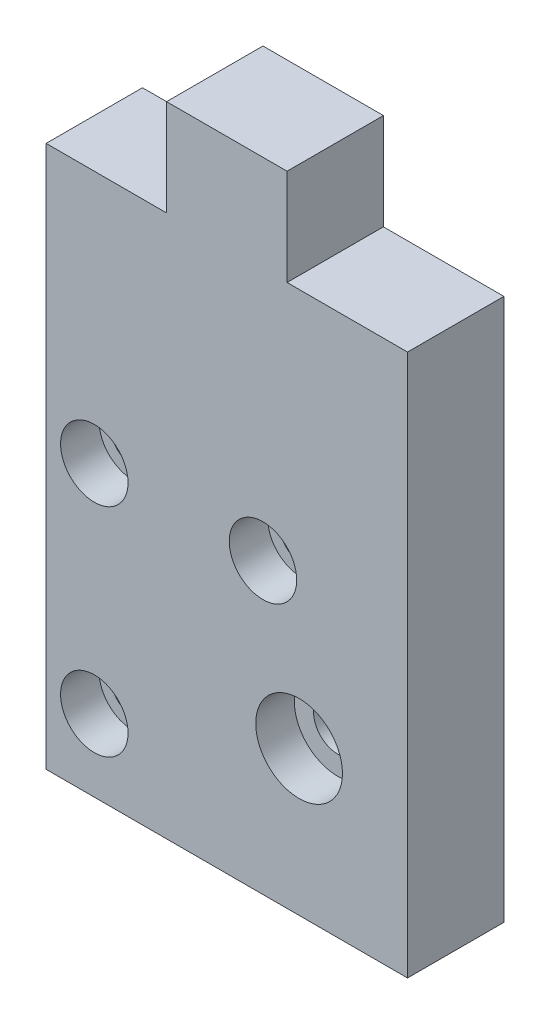
ISO-10303-21;
HEADER;
FILE_DESCRIPTION(('STEP AP214'),'2;1');
FILE_NAME('part.step','',(''),(''),'','','');
FILE_SCHEMA(('AUTOMOTIVE_DESIGN { 1 0 10303 214 1 1 1 1 }'));
ENDSEC;
DATA;
#1=APPLICATION_CONTEXT('core data for automotive mechanical design processes');
#2=APPLICATION_PROTOCOL_DEFINITION('international standard','automotive_design',2000,#1);
#3=PRODUCT_CONTEXT('',#1,'mechanical');
#4=PRODUCT('Part','Part','',(#3));
#5=PRODUCT_RELATED_PRODUCT_CATEGORY('part','',(#4));
#6=PRODUCT_DEFINITION_FORMATION('','',#4);
#7=PRODUCT_DEFINITION_CONTEXT('part definition',#1,'design');
#8=PRODUCT_DEFINITION('design','',#6,#7);
#9=PRODUCT_DEFINITION_SHAPE('','',#8);
#10=(LENGTH_UNIT() NAMED_UNIT(*) SI_UNIT(.MILLI.,.METRE.));
#11=(NAMED_UNIT(*) PLANE_ANGLE_UNIT() SI_UNIT($,.RADIAN.));
#12=(NAMED_UNIT(*) SI_UNIT($,.STERADIAN.) SOLID_ANGLE_UNIT());
#13=UNCERTAINTY_MEASURE_WITH_UNIT(LENGTH_MEASURE(1.E-05),#10,'distance_accuracy_value','');
#14=(GEOMETRIC_REPRESENTATION_CONTEXT(3) GLOBAL_UNCERTAINTY_ASSIGNED_CONTEXT((#13)) GLOBAL_UNIT_ASSIGNED_CONTEXT((#10,
#11,#12)) REPRESENTATION_CONTEXT('',''));
#15=CARTESIAN_POINT('',(0.,0.,0.));
#16=DIRECTION('',(0.,0.,1.));
#17=DIRECTION('',(1.,0.,0.));
#18=AXIS2_PLACEMENT_3D('',#15,#16,#17);
#19=CARTESIAN_POINT('',(5.08,7.62,10.16));
#20=DIRECTION('',(0.,0.,-1.));
#21=DIRECTION('',(-1.,0.,0.));
#22=AXIS2_PLACEMENT_3D('',#19,#20,#21);
#23=CYLINDRICAL_SURFACE('',#22,2.286);
#24=CARTESIAN_POINT('',(5.08,7.62,0.));
#25=DIRECTION('',(0.,0.,1.));
#26=DIRECTION('',(1.,0.,0.));
#27=AXIS2_PLACEMENT_3D('',#24,#25,#26);
#28=CIRCLE('',#27,2.286);
#29=CARTESIAN_POINT('',(7.366,7.62,0.));
#30=VERTEX_POINT('',#29);
#31=EDGE_CURVE('E136',#30,#30,#28,.T.);
#32=ORIENTED_EDGE('',*,*,#31,.F.);
#33=EDGE_LOOP('',(#32));
#34=FACE_BOUND('',#33,.T.);
#35=CARTESIAN_POINT('',(5.08,7.62,6.096));
#36=DIRECTION('',(0.,0.,1.));
#37=DIRECTION('',(1.,0.,0.));
#38=AXIS2_PLACEMENT_3D('',#35,#36,#37);
#39=CIRCLE('',#38,2.286);
#40=CARTESIAN_POINT('',(7.366,7.62,6.096));
#41=VERTEX_POINT('',#40);
#42=EDGE_CURVE('E37',#41,#41,#39,.T.);
#43=ORIENTED_EDGE('',*,*,#42,.T.);
#44=EDGE_LOOP('',(#43));
#45=FACE_BOUND('',#44,.T.);
#46=ADVANCED_FACE('F33',(#34,#45),#23,.F.);
#47=CARTESIAN_POINT('',(5.08,30.48,10.16));
#48=DIRECTION('',(0.,0.,-1.));
#49=DIRECTION('',(-1.,0.,0.));
#50=AXIS2_PLACEMENT_3D('',#47,#48,#49);
#51=CYLINDRICAL_SURFACE('',#50,2.286);
#52=CARTESIAN_POINT('',(5.08,30.48,0.));
#53=DIRECTION('',(0.,0.,1.));
#54=DIRECTION('',(1.,0.,0.));
#55=AXIS2_PLACEMENT_3D('',#52,#53,#54);
#56=CIRCLE('',#55,2.286);
#57=CARTESIAN_POINT('',(7.366,30.48,0.));
#58=VERTEX_POINT('',#57);
#59=EDGE_CURVE('E179',#58,#58,#56,.T.);
#60=ORIENTED_EDGE('',*,*,#59,.F.);
#61=EDGE_LOOP('',(#60));
#62=FACE_BOUND('',#61,.T.);
#63=CARTESIAN_POINT('',(5.08,30.48,6.096));
#64=DIRECTION('',(0.,0.,1.));
#65=DIRECTION('',(1.,0.,0.));
#66=AXIS2_PLACEMENT_3D('',#63,#64,#65);
#67=CIRCLE('',#66,2.286);
#68=CARTESIAN_POINT('',(7.366,30.48,6.096));
#69=VERTEX_POINT('',#68);
#70=EDGE_CURVE('E165',#69,#69,#67,.T.);
#71=ORIENTED_EDGE('',*,*,#70,.T.);
#72=EDGE_LOOP('',(#71));
#73=FACE_BOUND('',#72,.T.);
#74=ADVANCED_FACE('F226',(#62,#73),#51,.F.);
#75=CARTESIAN_POINT('',(26.67,15.24,10.16));
#76=DIRECTION('',(0.,0.,-1.));
#77=DIRECTION('',(-1.,0.,0.));
#78=AXIS2_PLACEMENT_3D('',#75,#76,#77);
#79=CYLINDRICAL_SURFACE('',#78,2.54);
#80=CARTESIAN_POINT('',(26.67,15.24,0.));
#81=DIRECTION('',(0.,0.,1.));
#82=DIRECTION('',(1.,0.,0.));
#83=AXIS2_PLACEMENT_3D('',#80,#81,#82);
#84=CIRCLE('',#83,2.54);
#85=CARTESIAN_POINT('',(29.21,15.24,0.));
#86=VERTEX_POINT('',#85);
#87=EDGE_CURVE('E174',#86,#86,#84,.T.);
#88=ORIENTED_EDGE('',*,*,#87,.F.);
#89=EDGE_LOOP('',(#88));
#90=FACE_BOUND('',#89,.T.);
#91=CARTESIAN_POINT('',(26.67,15.24,6.096));
#92=DIRECTION('',(0.,0.,1.));
#93=DIRECTION('',(1.,0.,0.));
#94=AXIS2_PLACEMENT_3D('',#91,#92,#93);
#95=CIRCLE('',#94,2.54);
#96=CARTESIAN_POINT('',(29.21,15.24,6.096));
#97=VERTEX_POINT('',#96);
#98=EDGE_CURVE('E162',#97,#97,#95,.T.);
#99=ORIENTED_EDGE('',*,*,#98,.T.);
#100=EDGE_LOOP('',(#99));
#101=FACE_BOUND('',#100,.T.);
#102=ADVANCED_FACE('F232',(#90,#101),#79,.F.);
#103=CARTESIAN_POINT('',(22.86,30.48,10.16));
#104=DIRECTION('',(0.,0.,-1.));
#105=DIRECTION('',(-1.,0.,0.));
#106=AXIS2_PLACEMENT_3D('',#103,#104,#105);
#107=CYLINDRICAL_SURFACE('',#106,2.286);
#108=CARTESIAN_POINT('',(22.86,30.48,0.));
#109=DIRECTION('',(0.,0.,1.));
#110=DIRECTION('',(1.,0.,0.));
#111=AXIS2_PLACEMENT_3D('',#108,#109,#110);
#112=CIRCLE('',#111,2.286);
#113=CARTESIAN_POINT('',(25.146,30.48,0.));
#114=VERTEX_POINT('',#113);
#115=EDGE_CURVE('E170',#114,#114,#112,.T.);
#116=ORIENTED_EDGE('',*,*,#115,.F.);
#117=EDGE_LOOP('',(#116));
#118=FACE_BOUND('',#117,.T.);
#119=CARTESIAN_POINT('',(22.86,30.48,6.096));
#120=DIRECTION('',(0.,0.,1.));
#121=DIRECTION('',(1.,0.,0.));
#122=AXIS2_PLACEMENT_3D('',#119,#120,#121);
#123=CIRCLE('',#122,2.286);
#124=CARTESIAN_POINT('',(25.146,30.48,6.096));
#125=VERTEX_POINT('',#124);
#126=EDGE_CURVE('E159',#125,#125,#123,.T.);
#127=ORIENTED_EDGE('',*,*,#126,.T.);
#128=EDGE_LOOP('',(#127));
#129=FACE_BOUND('',#128,.T.);
#130=ADVANCED_FACE('F239',(#118,#129),#107,.F.);
#131=CARTESIAN_POINT('',(0.,0.,10.16));
#132=DIRECTION('',(0.,0.,1.));
#133=DIRECTION('',(1.,0.,0.));
#134=AXIS2_PLACEMENT_3D('',#131,#132,#133);
#135=PLANE('',#134);
#136=CARTESIAN_POINT('',(22.86,30.48,10.16));
#137=DIRECTION('',(0.,0.,1.));
#138=DIRECTION('',(1.,0.,0.));
#139=AXIS2_PLACEMENT_3D('',#136,#137,#138);
#140=CIRCLE('',#139,3.556);
#141=CARTESIAN_POINT('',(26.416,30.48,10.16));
#142=VERTEX_POINT('',#141);
#143=EDGE_CURVE('E266',#142,#142,#140,.T.);
#144=ORIENTED_EDGE('',*,*,#143,.F.);
#145=EDGE_LOOP('',(#144));
#146=FACE_BOUND('',#145,.T.);
#147=CARTESIAN_POINT('',(5.08,7.62,10.16));
#148=DIRECTION('',(0.,0.,1.));
#149=DIRECTION('',(1.,0.,0.));
#150=AXIS2_PLACEMENT_3D('',#147,#148,#149);
#151=CIRCLE('',#150,3.556);
#152=CARTESIAN_POINT('',(8.636,7.62,10.16));
#153=VERTEX_POINT('',#152);
#154=EDGE_CURVE('E260',#153,#153,#151,.T.);
#155=ORIENTED_EDGE('',*,*,#154,.F.);
#156=EDGE_LOOP('',(#155));
#157=FACE_BOUND('',#156,.T.);
#158=CARTESIAN_POINT('',(26.67,15.24,10.16));
#159=DIRECTION('',(0.,0.,1.));
#160=DIRECTION('',(1.,0.,0.));
#161=AXIS2_PLACEMENT_3D('',#158,#159,#160);
#162=CIRCLE('',#161,4.572);
#163=CARTESIAN_POINT('',(31.242,15.24,10.16));
#164=VERTEX_POINT('',#163);
#165=EDGE_CURVE('E254',#164,#164,#162,.T.);
#166=ORIENTED_EDGE('',*,*,#165,.F.);
#167=EDGE_LOOP('',(#166));
#168=FACE_BOUND('',#167,.T.);
#169=CARTESIAN_POINT('',(5.08,30.48,10.16));
#170=DIRECTION('',(0.,0.,1.));
#171=DIRECTION('',(1.,0.,0.));
#172=AXIS2_PLACEMENT_3D('',#169,#170,#171);
#173=CIRCLE('',#172,3.556);
#174=CARTESIAN_POINT('',(8.636,30.48,10.16));
#175=VERTEX_POINT('',#174);
#176=EDGE_CURVE('E182',#175,#175,#173,.T.);
#177=ORIENTED_EDGE('',*,*,#176,.F.);
#178=EDGE_LOOP('',(#177));
#179=FACE_BOUND('',#178,.T.);
#180=DIRECTION('',(0.,-1.,0.));
#181=VECTOR('',#180,1.);
#182=CARTESIAN_POINT('',(0.,57.15,10.16));
#183=LINE('',#182,#181);
#184=CARTESIAN_POINT('',(0.,57.15,10.16));
#185=VERTEX_POINT('',#184);
#186=CARTESIAN_POINT('',(0.,0.,10.16));
#187=VERTEX_POINT('',#186);
#188=EDGE_CURVE('E147',#185,#187,#183,.T.);
#189=ORIENTED_EDGE('',*,*,#188,.T.);
#190=DIRECTION('',(1.,0.,0.));
#191=VECTOR('',#190,1.);
#192=CARTESIAN_POINT('',(0.,0.,10.16));
#193=LINE('',#192,#191);
#194=CARTESIAN_POINT('',(38.1,0.,10.16));
#195=VERTEX_POINT('',#194);
#196=EDGE_CURVE('E95',#187,#195,#193,.T.);
#197=ORIENTED_EDGE('',*,*,#196,.T.);
#198=DIRECTION('',(0.,1.,0.));
#199=VECTOR('',#198,1.);
#200=CARTESIAN_POINT('',(38.1,57.15,10.16));
#201=LINE('',#200,#199);
#202=CARTESIAN_POINT('',(38.1,57.15,10.16));
#203=VERTEX_POINT('',#202);
#204=EDGE_CURVE('E191',#195,#203,#201,.T.);
#205=ORIENTED_EDGE('',*,*,#204,.T.);
#206=DIRECTION('',(-1.,0.,0.));
#207=VECTOR('',#206,1.);
#208=CARTESIAN_POINT('',(25.4,57.15,10.16));
#209=LINE('',#208,#207);
#210=CARTESIAN_POINT('',(25.4,57.15,10.16));
#211=VERTEX_POINT('',#210);
#212=EDGE_CURVE('E193',#203,#211,#209,.T.);
#213=ORIENTED_EDGE('',*,*,#212,.T.);
#214=DIRECTION('',(0.,1.,0.));
#215=VECTOR('',#214,1.);
#216=CARTESIAN_POINT('',(25.4,67.31,10.16));
#217=LINE('',#216,#215);
#218=CARTESIAN_POINT('',(25.4,67.31,10.16));
#219=VERTEX_POINT('',#218);
#220=EDGE_CURVE('E114',#211,#219,#217,.T.);
#221=ORIENTED_EDGE('',*,*,#220,.T.);
#222=DIRECTION('',(-1.,0.,0.));
#223=VECTOR('',#222,1.);
#224=CARTESIAN_POINT('',(12.7,67.31,10.16));
#225=LINE('',#224,#223);
#226=CARTESIAN_POINT('',(12.7,67.31,10.16));
#227=VERTEX_POINT('',#226);
#228=EDGE_CURVE('E108',#219,#227,#225,.T.);
#229=ORIENTED_EDGE('',*,*,#228,.T.);
#230=DIRECTION('',(0.,-1.,0.));
#231=VECTOR('',#230,1.);
#232=CARTESIAN_POINT('',(12.7,57.15,10.16));
#233=LINE('',#232,#231);
#234=CARTESIAN_POINT('',(12.7,57.15,10.16));
#235=VERTEX_POINT('',#234);
#236=EDGE_CURVE('E112',#227,#235,#233,.T.);
#237=ORIENTED_EDGE('',*,*,#236,.T.);
#238=DIRECTION('',(-1.,0.,0.));
#239=VECTOR('',#238,1.);
#240=CARTESIAN_POINT('',(0.,57.15,10.16));
#241=LINE('',#240,#239);
#242=EDGE_CURVE('E52',#235,#185,#241,.T.);
#243=ORIENTED_EDGE('',*,*,#242,.T.);
#244=EDGE_LOOP('',(#189,#197,#205,#213,#221,#229,#237,#243));
#245=FACE_BOUND('',#244,.T.);
#246=ADVANCED_FACE('F110',(#146,#157,#168,#179,#245),#135,.T.);
#247=CARTESIAN_POINT('',(0.,0.,0.));
#248=DIRECTION('',(0.,0.,1.));
#249=DIRECTION('',(1.,0.,0.));
#250=AXIS2_PLACEMENT_3D('',#247,#248,#249);
#251=PLANE('',#250);
#252=CARTESIAN_POINT('',(19.05,62.23,0.));
#253=DIRECTION('',(0.,0.,-1.));
#254=DIRECTION('',(-1.,0.,0.));
#255=AXIS2_PLACEMENT_3D('',#252,#253,#254);
#256=CIRCLE('',#255,1.27);
#257=CARTESIAN_POINT('',(17.78,62.23,0.));
#258=VERTEX_POINT('',#257);
#259=EDGE_CURVE('E249',#258,#258,#256,.T.);
#260=ORIENTED_EDGE('',*,*,#259,.F.);
#261=EDGE_LOOP('',(#260));
#262=FACE_BOUND('',#261,.T.);
#263=DIRECTION('',(0.,-1.,0.));
#264=VECTOR('',#263,1.);
#265=CARTESIAN_POINT('',(0.,57.15,0.));
#266=LINE('',#265,#264);
#267=CARTESIAN_POINT('',(0.,57.15,0.));
#268=VERTEX_POINT('',#267);
#269=CARTESIAN_POINT('',(0.,0.,0.));
#270=VERTEX_POINT('',#269);
#271=EDGE_CURVE('E132',#268,#270,#266,.T.);
#272=ORIENTED_EDGE('',*,*,#271,.F.);
#273=DIRECTION('',(-1.,0.,0.));
#274=VECTOR('',#273,1.);
#275=CARTESIAN_POINT('',(0.,57.15,0.));
#276=LINE('',#275,#274);
#277=CARTESIAN_POINT('',(12.7,57.15,0.));
#278=VERTEX_POINT('',#277);
#279=EDGE_CURVE('E87',#278,#268,#276,.T.);
#280=ORIENTED_EDGE('',*,*,#279,.F.);
#281=DIRECTION('',(0.,-1.,0.));
#282=VECTOR('',#281,1.);
#283=CARTESIAN_POINT('',(12.7,57.15,0.));
#284=LINE('',#283,#282);
#285=CARTESIAN_POINT('',(12.7,67.31,0.));
#286=VERTEX_POINT('',#285);
#287=EDGE_CURVE('E81',#286,#278,#284,.T.);
#288=ORIENTED_EDGE('',*,*,#287,.F.);
#289=DIRECTION('',(-1.,0.,0.));
#290=VECTOR('',#289,1.);
#291=CARTESIAN_POINT('',(12.7,67.31,0.));
#292=LINE('',#291,#290);
#293=CARTESIAN_POINT('',(25.4,67.31,0.));
#294=VERTEX_POINT('',#293);
#295=EDGE_CURVE('E122',#294,#286,#292,.T.);
#296=ORIENTED_EDGE('',*,*,#295,.F.);
#297=DIRECTION('',(0.,1.,0.));
#298=VECTOR('',#297,1.);
#299=CARTESIAN_POINT('',(25.4,67.31,0.));
#300=LINE('',#299,#298);
#301=CARTESIAN_POINT('',(25.4,57.15,0.));
#302=VERTEX_POINT('',#301);
#303=EDGE_CURVE('E142',#302,#294,#300,.T.);
#304=ORIENTED_EDGE('',*,*,#303,.F.);
#305=DIRECTION('',(-1.,0.,0.));
#306=VECTOR('',#305,1.);
#307=CARTESIAN_POINT('',(25.4,57.15,0.));
#308=LINE('',#307,#306);
#309=CARTESIAN_POINT('',(38.1,57.15,0.));
#310=VERTEX_POINT('',#309);
#311=EDGE_CURVE('E140',#310,#302,#308,.T.);
#312=ORIENTED_EDGE('',*,*,#311,.F.);
#313=DIRECTION('',(0.,1.,0.));
#314=VECTOR('',#313,1.);
#315=CARTESIAN_POINT('',(38.1,57.15,0.));
#316=LINE('',#315,#314);
#317=CARTESIAN_POINT('',(38.1,0.,0.));
#318=VERTEX_POINT('',#317);
#319=EDGE_CURVE('E138',#318,#310,#316,.T.);
#320=ORIENTED_EDGE('',*,*,#319,.F.);
#321=DIRECTION('',(1.,0.,0.));
#322=VECTOR('',#321,1.);
#323=CARTESIAN_POINT('',(0.,0.,0.));
#324=LINE('',#323,#322);
#325=EDGE_CURVE('E135',#270,#318,#324,.T.);
#326=ORIENTED_EDGE('',*,*,#325,.F.);
#327=EDGE_LOOP('',(#272,#280,#288,#296,#304,#312,#320,#326));
#328=FACE_BOUND('',#327,.T.);
#329=ORIENTED_EDGE('',*,*,#31,.T.);
#330=EDGE_LOOP('',(#329));
#331=FACE_BOUND('',#330,.T.);
#332=ORIENTED_EDGE('',*,*,#59,.T.);
#333=EDGE_LOOP('',(#332));
#334=FACE_BOUND('',#333,.T.);
#335=ORIENTED_EDGE('',*,*,#87,.T.);
#336=EDGE_LOOP('',(#335));
#337=FACE_BOUND('',#336,.T.);
#338=ORIENTED_EDGE('',*,*,#115,.T.);
#339=EDGE_LOOP('',(#338));
#340=FACE_BOUND('',#339,.T.);
#341=ADVANCED_FACE('F206',(#262,#328,#331,#334,#337,#340),#251,.F.);
#342=CARTESIAN_POINT('',(0.,57.15,10.16));
#343=DIRECTION('',(1.,0.,0.));
#344=DIRECTION('',(0.,0.,-1.));
#345=AXIS2_PLACEMENT_3D('',#342,#343,#344);
#346=PLANE('',#345);
#347=ORIENTED_EDGE('',*,*,#271,.T.);
#348=DIRECTION('',(0.,0.,-1.));
#349=VECTOR('',#348,1.);
#350=CARTESIAN_POINT('',(0.,0.,10.16));
#351=LINE('',#350,#349);
#352=EDGE_CURVE('E11',#187,#270,#351,.T.);
#353=ORIENTED_EDGE('',*,*,#352,.F.);
#354=ORIENTED_EDGE('',*,*,#188,.F.);
#355=DIRECTION('',(0.,0.,-1.));
#356=VECTOR('',#355,1.);
#357=CARTESIAN_POINT('',(0.,57.15,10.16));
#358=LINE('',#357,#356);
#359=EDGE_CURVE('E128',#185,#268,#358,.T.);
#360=ORIENTED_EDGE('',*,*,#359,.T.);
#361=EDGE_LOOP('',(#347,#353,#354,#360));
#362=FACE_BOUND('',#361,.T.);
#363=ADVANCED_FACE('F35',(#362),#346,.F.);
#364=CARTESIAN_POINT('',(0.,0.,10.16));
#365=DIRECTION('',(0.,1.,0.));
#366=DIRECTION('',(0.,0.,1.));
#367=AXIS2_PLACEMENT_3D('',#364,#365,#366);
#368=PLANE('',#367);
#369=ORIENTED_EDGE('',*,*,#325,.T.);
#370=DIRECTION('',(0.,0.,-1.));
#371=VECTOR('',#370,1.);
#372=CARTESIAN_POINT('',(38.1,0.,10.16));
#373=LINE('',#372,#371);
#374=EDGE_CURVE('E43',#195,#318,#373,.T.);
#375=ORIENTED_EDGE('',*,*,#374,.F.);
#376=ORIENTED_EDGE('',*,*,#196,.F.);
#377=ORIENTED_EDGE('',*,*,#352,.T.);
#378=EDGE_LOOP('',(#369,#375,#376,#377));
#379=FACE_BOUND('',#378,.T.);
#380=ADVANCED_FACE('F246',(#379),#368,.F.);
#381=CARTESIAN_POINT('',(38.1,57.15,10.16));
#382=DIRECTION('',(-1.,0.,0.));
#383=DIRECTION('',(0.,0.,1.));
#384=AXIS2_PLACEMENT_3D('',#381,#382,#383);
#385=PLANE('',#384);
#386=ORIENTED_EDGE('',*,*,#319,.T.);
#387=DIRECTION('',(0.,0.,-1.));
#388=VECTOR('',#387,1.);
#389=CARTESIAN_POINT('',(38.1,57.15,10.16));
#390=LINE('',#389,#388);
#391=EDGE_CURVE('E154',#203,#310,#390,.T.);
#392=ORIENTED_EDGE('',*,*,#391,.F.);
#393=ORIENTED_EDGE('',*,*,#204,.F.);
#394=ORIENTED_EDGE('',*,*,#374,.T.);
#395=EDGE_LOOP('',(#386,#392,#393,#394));
#396=FACE_BOUND('',#395,.T.);
#397=ADVANCED_FACE('F440',(#396),#385,.F.);
#398=CARTESIAN_POINT('',(25.4,57.15,10.16));
#399=DIRECTION('',(0.,-1.,0.));
#400=DIRECTION('',(1.,0.,0.));
#401=AXIS2_PLACEMENT_3D('',#398,#399,#400);
#402=PLANE('',#401);
#403=ORIENTED_EDGE('',*,*,#311,.T.);
#404=DIRECTION('',(0.,0.,-1.));
#405=VECTOR('',#404,1.);
#406=CARTESIAN_POINT('',(25.4,57.15,10.16));
#407=LINE('',#406,#405);
#408=EDGE_CURVE('E151',#211,#302,#407,.T.);
#409=ORIENTED_EDGE('',*,*,#408,.F.);
#410=ORIENTED_EDGE('',*,*,#212,.F.);
#411=ORIENTED_EDGE('',*,*,#391,.T.);
#412=EDGE_LOOP('',(#403,#409,#410,#411));
#413=FACE_BOUND('',#412,.T.);
#414=ADVANCED_FACE('F199',(#413),#402,.F.);
#415=CARTESIAN_POINT('',(25.4,67.31,10.16));
#416=DIRECTION('',(-1.,0.,0.));
#417=DIRECTION('',(0.,0.,1.));
#418=AXIS2_PLACEMENT_3D('',#415,#416,#417);
#419=PLANE('',#418);
#420=ORIENTED_EDGE('',*,*,#303,.T.);
#421=DIRECTION('',(0.,0.,-1.));
#422=VECTOR('',#421,1.);
#423=CARTESIAN_POINT('',(25.4,67.31,10.16));
#424=LINE('',#423,#422);
#425=EDGE_CURVE('E123',#219,#294,#424,.T.);
#426=ORIENTED_EDGE('',*,*,#425,.F.);
#427=ORIENTED_EDGE('',*,*,#220,.F.);
#428=ORIENTED_EDGE('',*,*,#408,.T.);
#429=EDGE_LOOP('',(#420,#426,#427,#428));
#430=FACE_BOUND('',#429,.T.);
#431=ADVANCED_FACE('F203',(#430),#419,.F.);
#432=CARTESIAN_POINT('',(12.7,67.31,10.16));
#433=DIRECTION('',(0.,-1.,0.));
#434=DIRECTION('',(0.,0.,-1.));
#435=AXIS2_PLACEMENT_3D('',#432,#433,#434);
#436=PLANE('',#435);
#437=ORIENTED_EDGE('',*,*,#295,.T.);
#438=DIRECTION('',(0.,0.,-1.));
#439=VECTOR('',#438,1.);
#440=CARTESIAN_POINT('',(12.7,67.31,10.16));
#441=LINE('',#440,#439);
#442=EDGE_CURVE('E119',#227,#286,#441,.T.);
#443=ORIENTED_EDGE('',*,*,#442,.F.);
#444=ORIENTED_EDGE('',*,*,#228,.F.);
#445=ORIENTED_EDGE('',*,*,#425,.T.);
#446=EDGE_LOOP('',(#437,#443,#444,#445));
#447=FACE_BOUND('',#446,.T.);
#448=ADVANCED_FACE('F120',(#447),#436,.F.);
#449=CARTESIAN_POINT('',(12.7,57.15,10.16));
#450=DIRECTION('',(1.,0.,0.));
#451=DIRECTION('',(0.,0.,-1.));
#452=AXIS2_PLACEMENT_3D('',#449,#450,#451);
#453=PLANE('',#452);
#454=ORIENTED_EDGE('',*,*,#287,.T.);
#455=DIRECTION('',(0.,0.,-1.));
#456=VECTOR('',#455,1.);
#457=CARTESIAN_POINT('',(12.7,57.15,10.16));
#458=LINE('',#457,#456);
#459=EDGE_CURVE('E124',#235,#278,#458,.T.);
#460=ORIENTED_EDGE('',*,*,#459,.F.);
#461=ORIENTED_EDGE('',*,*,#236,.F.);
#462=ORIENTED_EDGE('',*,*,#442,.T.);
#463=EDGE_LOOP('',(#454,#460,#461,#462));
#464=FACE_BOUND('',#463,.T.);
#465=ADVANCED_FACE('F126',(#464),#453,.F.);
#466=CARTESIAN_POINT('',(0.,57.15,10.16));
#467=DIRECTION('',(0.,-1.,0.));
#468=DIRECTION('',(0.,0.,-1.));
#469=AXIS2_PLACEMENT_3D('',#466,#467,#468);
#470=PLANE('',#469);
#471=ORIENTED_EDGE('',*,*,#279,.T.);
#472=ORIENTED_EDGE('',*,*,#359,.F.);
#473=ORIENTED_EDGE('',*,*,#242,.F.);
#474=ORIENTED_EDGE('',*,*,#459,.T.);
#475=EDGE_LOOP('',(#471,#472,#473,#474));
#476=FACE_BOUND('',#475,.T.);
#477=ADVANCED_FACE('F212',(#476),#470,.F.);
#478=CARTESIAN_POINT('',(22.86,30.48,6.096));
#479=DIRECTION('',(0.,0.,1.));
#480=DIRECTION('',(1.,0.,0.));
#481=AXIS2_PLACEMENT_3D('',#478,#479,#480);
#482=CYLINDRICAL_SURFACE('',#481,3.556);
#483=CARTESIAN_POINT('',(22.86,30.48,6.096));
#484=DIRECTION('',(0.,0.,1.));
#485=DIRECTION('',(1.,0.,0.));
#486=AXIS2_PLACEMENT_3D('',#483,#484,#485);
#487=CIRCLE('',#486,3.556);
#488=CARTESIAN_POINT('',(26.416,30.48,6.096));
#489=VERTEX_POINT('',#488);
#490=EDGE_CURVE('E263',#489,#489,#487,.T.);
#491=ORIENTED_EDGE('',*,*,#490,.F.);
#492=EDGE_LOOP('',(#491));
#493=FACE_BOUND('',#492,.T.);
#494=ORIENTED_EDGE('',*,*,#143,.T.);
#495=EDGE_LOOP('',(#494));
#496=FACE_BOUND('',#495,.T.);
#497=ADVANCED_FACE('F214',(#493,#496),#482,.F.);
#498=CARTESIAN_POINT('',(22.86,30.48,6.096));
#499=DIRECTION('',(0.,0.,1.));
#500=DIRECTION('',(1.,0.,0.));
#501=AXIS2_PLACEMENT_3D('',#498,#499,#500);
#502=PLANE('',#501);
#503=ORIENTED_EDGE('',*,*,#126,.F.);
#504=EDGE_LOOP('',(#503));
#505=FACE_BOUND('',#504,.T.);
#506=ORIENTED_EDGE('',*,*,#490,.T.);
#507=EDGE_LOOP('',(#506));
#508=FACE_BOUND('',#507,.T.);
#509=ADVANCED_FACE('F220',(#505,#508),#502,.T.);
#510=CARTESIAN_POINT('',(26.67,15.24,6.096));
#511=DIRECTION('',(0.,0.,1.));
#512=DIRECTION('',(1.,0.,0.));
#513=AXIS2_PLACEMENT_3D('',#510,#511,#512);
#514=CYLINDRICAL_SURFACE('',#513,4.572);
#515=CARTESIAN_POINT('',(26.67,15.24,6.096));
#516=DIRECTION('',(0.,0.,1.));
#517=DIRECTION('',(1.,0.,0.));
#518=AXIS2_PLACEMENT_3D('',#515,#516,#517);
#519=CIRCLE('',#518,4.572);
#520=CARTESIAN_POINT('',(31.242,15.24,6.096));
#521=VERTEX_POINT('',#520);
#522=EDGE_CURVE('E257',#521,#521,#519,.T.);
#523=ORIENTED_EDGE('',*,*,#522,.F.);
#524=EDGE_LOOP('',(#523));
#525=FACE_BOUND('',#524,.T.);
#526=ORIENTED_EDGE('',*,*,#165,.T.);
#527=EDGE_LOOP('',(#526));
#528=FACE_BOUND('',#527,.T.);
#529=ADVANCED_FACE('F293',(#525,#528),#514,.F.);
#530=CARTESIAN_POINT('',(26.67,15.24,6.096));
#531=DIRECTION('',(0.,0.,1.));
#532=DIRECTION('',(1.,0.,0.));
#533=AXIS2_PLACEMENT_3D('',#530,#531,#532);
#534=PLANE('',#533);
#535=ORIENTED_EDGE('',*,*,#98,.F.);
#536=EDGE_LOOP('',(#535));
#537=FACE_BOUND('',#536,.T.);
#538=ORIENTED_EDGE('',*,*,#522,.T.);
#539=EDGE_LOOP('',(#538));
#540=FACE_BOUND('',#539,.T.);
#541=ADVANCED_FACE('F283',(#537,#540),#534,.T.);
#542=CARTESIAN_POINT('',(5.08,30.48,6.096));
#543=DIRECTION('',(0.,0.,1.));
#544=DIRECTION('',(1.,0.,0.));
#545=AXIS2_PLACEMENT_3D('',#542,#543,#544);
#546=CYLINDRICAL_SURFACE('',#545,3.556);
#547=CARTESIAN_POINT('',(5.08,30.48,6.096));
#548=DIRECTION('',(0.,0.,1.));
#549=DIRECTION('',(1.,0.,0.));
#550=AXIS2_PLACEMENT_3D('',#547,#548,#549);
#551=CIRCLE('',#550,3.556);
#552=CARTESIAN_POINT('',(8.636,30.48,6.096));
#553=VERTEX_POINT('',#552);
#554=EDGE_CURVE('E163',#553,#553,#551,.T.);
#555=ORIENTED_EDGE('',*,*,#554,.F.);
#556=EDGE_LOOP('',(#555));
#557=FACE_BOUND('',#556,.T.);
#558=ORIENTED_EDGE('',*,*,#176,.T.);
#559=EDGE_LOOP('',(#558));
#560=FACE_BOUND('',#559,.T.);
#561=ADVANCED_FACE('F279',(#557,#560),#546,.F.);
#562=CARTESIAN_POINT('',(5.08,30.48,6.096));
#563=DIRECTION('',(0.,0.,1.));
#564=DIRECTION('',(1.,0.,0.));
#565=AXIS2_PLACEMENT_3D('',#562,#563,#564);
#566=PLANE('',#565);
#567=ORIENTED_EDGE('',*,*,#70,.F.);
#568=EDGE_LOOP('',(#567));
#569=FACE_BOUND('',#568,.T.);
#570=ORIENTED_EDGE('',*,*,#554,.T.);
#571=EDGE_LOOP('',(#570));
#572=FACE_BOUND('',#571,.T.);
#573=ADVANCED_FACE('F282',(#569,#572),#566,.T.);
#574=CARTESIAN_POINT('',(5.08,7.62,6.096));
#575=DIRECTION('',(0.,0.,1.));
#576=DIRECTION('',(1.,0.,0.));
#577=AXIS2_PLACEMENT_3D('',#574,#575,#576);
#578=CYLINDRICAL_SURFACE('',#577,3.556);
#579=CARTESIAN_POINT('',(5.08,7.62,6.096));
#580=DIRECTION('',(0.,0.,1.));
#581=DIRECTION('',(1.,0.,0.));
#582=AXIS2_PLACEMENT_3D('',#579,#580,#581);
#583=CIRCLE('',#582,3.556);
#584=CARTESIAN_POINT('',(8.636,7.62,6.096));
#585=VERTEX_POINT('',#584);
#586=EDGE_CURVE('E269',#585,#585,#583,.T.);
#587=ORIENTED_EDGE('',*,*,#586,.F.);
#588=EDGE_LOOP('',(#587));
#589=FACE_BOUND('',#588,.T.);
#590=ORIENTED_EDGE('',*,*,#154,.T.);
#591=EDGE_LOOP('',(#590));
#592=FACE_BOUND('',#591,.T.);
#593=ADVANCED_FACE('F290',(#589,#592),#578,.F.);
#594=CARTESIAN_POINT('',(5.08,7.62,6.096));
#595=DIRECTION('',(0.,0.,1.));
#596=DIRECTION('',(1.,0.,0.));
#597=AXIS2_PLACEMENT_3D('',#594,#595,#596);
#598=PLANE('',#597);
#599=ORIENTED_EDGE('',*,*,#42,.F.);
#600=EDGE_LOOP('',(#599));
#601=FACE_BOUND('',#600,.T.);
#602=ORIENTED_EDGE('',*,*,#586,.T.);
#603=EDGE_LOOP('',(#602));
#604=FACE_BOUND('',#603,.T.);
#605=ADVANCED_FACE('F322',(#601,#604),#598,.T.);
#606=CARTESIAN_POINT('',(19.05,62.23,0.508));
#607=DIRECTION('',(0.,0.,-1.));
#608=DIRECTION('',(-1.,0.,0.));
#609=AXIS2_PLACEMENT_3D('',#606,#607,#608);
#610=CYLINDRICAL_SURFACE('',#609,1.27);
#611=CARTESIAN_POINT('',(19.05,62.23,0.508));
#612=DIRECTION('',(0.,0.,-1.));
#613=DIRECTION('',(-1.,0.,0.));
#614=AXIS2_PLACEMENT_3D('',#611,#612,#613);
#615=CIRCLE('',#614,1.27);
#616=CARTESIAN_POINT('',(17.78,62.23,0.508));
#617=VERTEX_POINT('',#616);
#618=EDGE_CURVE('E251',#617,#617,#615,.T.);
#619=ORIENTED_EDGE('',*,*,#618,.F.);
#620=EDGE_LOOP('',(#619));
#621=FACE_BOUND('',#620,.T.);
#622=ORIENTED_EDGE('',*,*,#259,.T.);
#623=EDGE_LOOP('',(#622));
#624=FACE_BOUND('',#623,.T.);
#625=ADVANCED_FACE('F324',(#621,#624),#610,.F.);
#626=CARTESIAN_POINT('',(19.05,62.23,0.508));
#627=DIRECTION('',(0.,0.,-1.));
#628=DIRECTION('',(-1.,0.,0.));
#629=AXIS2_PLACEMENT_3D('',#626,#627,#628);
#630=PLANE('',#629);
#631=ORIENTED_EDGE('',*,*,#618,.T.);
#632=EDGE_LOOP('',(#631));
#633=FACE_BOUND('',#632,.T.);
#634=ADVANCED_FACE('F347',(#633),#630,.T.);
#635=CLOSED_SHELL('',(#46,#74,#102,#130,#246,#341,#363,#380,#397,#414,#431,#448,#465,#477,#497,
#509,#529,#541,#561,#573,#593,#605,#625,#634));
#636=MANIFOLD_SOLID_BREP('B2',#635);
#637=ADVANCED_BREP_SHAPE_REPRESENTATION('',(#18,#636),#14);
#638=SHAPE_DEFINITION_REPRESENTATION(#9,#637);
ENDSEC;
END-ISO-10303-21;
